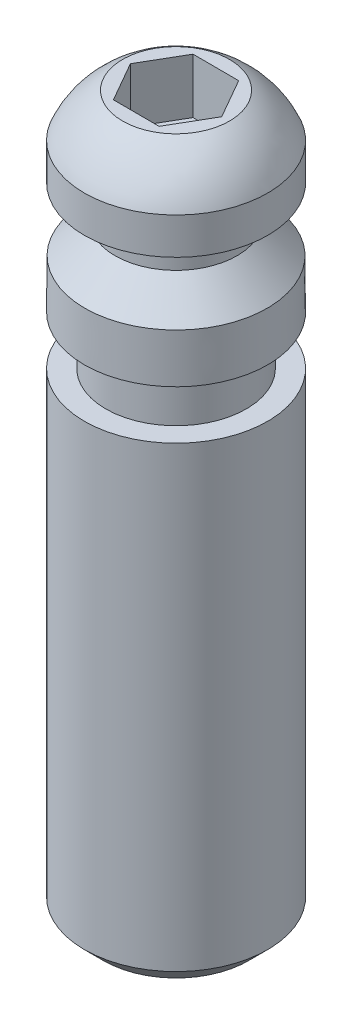
ISO-10303-21;
HEADER;
FILE_DESCRIPTION(('STEP AP214'),'2;1');
FILE_NAME('part.step','',(''),(''),'','','');
FILE_SCHEMA(('AUTOMOTIVE_DESIGN { 1 0 10303 214 1 1 1 1 }'));
ENDSEC;
DATA;
#1=APPLICATION_CONTEXT('core data for automotive mechanical design processes');
#2=APPLICATION_PROTOCOL_DEFINITION('international standard','automotive_design',2000,#1);
#3=PRODUCT_CONTEXT('',#1,'mechanical');
#4=PRODUCT('Part','Part','',(#3));
#5=PRODUCT_RELATED_PRODUCT_CATEGORY('part','',(#4));
#6=PRODUCT_DEFINITION_FORMATION('','',#4);
#7=PRODUCT_DEFINITION_CONTEXT('part definition',#1,'design');
#8=PRODUCT_DEFINITION('design','',#6,#7);
#9=PRODUCT_DEFINITION_SHAPE('','',#8);
#10=(LENGTH_UNIT() NAMED_UNIT(*) SI_UNIT(.MILLI.,.METRE.));
#11=(NAMED_UNIT(*) PLANE_ANGLE_UNIT() SI_UNIT($,.RADIAN.));
#12=(NAMED_UNIT(*) SI_UNIT($,.STERADIAN.) SOLID_ANGLE_UNIT());
#13=UNCERTAINTY_MEASURE_WITH_UNIT(LENGTH_MEASURE(1.E-05),#10,'distance_accuracy_value','');
#14=(GEOMETRIC_REPRESENTATION_CONTEXT(3) GLOBAL_UNCERTAINTY_ASSIGNED_CONTEXT((#13)) GLOBAL_UNIT_ASSIGNED_CONTEXT((#10,
#11,#12)) REPRESENTATION_CONTEXT('',''));
#15=CARTESIAN_POINT('',(0.,0.,0.));
#16=DIRECTION('',(0.,0.,1.));
#17=DIRECTION('',(1.,0.,0.));
#18=AXIS2_PLACEMENT_3D('',#15,#16,#17);
#19=CARTESIAN_POINT('',(0.,23.5,0.));
#20=DIRECTION('',(0.,-1.,0.));
#21=DIRECTION('',(0.,0.,-1.));
#22=AXIS2_PLACEMENT_3D('',#19,#20,#21);
#23=CYLINDRICAL_SURFACE('',#22,3.);
#24=CARTESIAN_POINT('',(0.,0.625000000000004,0.));
#25=DIRECTION('',(0.,1.,0.));
#26=DIRECTION('',(0.,0.,1.));
#27=AXIS2_PLACEMENT_3D('',#24,#25,#26);
#28=CIRCLE('',#27,3.);
#29=CARTESIAN_POINT('',(0.,0.625000000000004,3.));
#30=VERTEX_POINT('',#29);
#31=EDGE_CURVE('E44',#30,#30,#28,.T.);
#32=ORIENTED_EDGE('',*,*,#31,.T.);
#33=EDGE_LOOP('',(#32));
#34=FACE_BOUND('',#33,.T.);
#35=CARTESIAN_POINT('',(0.,15.6100982781377,0.));
#36=DIRECTION('',(0.,1.,0.));
#37=DIRECTION('',(0.,0.,1.));
#38=AXIS2_PLACEMENT_3D('',#35,#36,#37);
#39=CIRCLE('',#38,3.);
#40=CARTESIAN_POINT('',(0.,15.6100982781377,3.));
#41=VERTEX_POINT('',#40);
#42=EDGE_CURVE('E170',#41,#41,#39,.T.);
#43=ORIENTED_EDGE('',*,*,#42,.F.);
#44=EDGE_LOOP('',(#43));
#45=FACE_BOUND('',#44,.T.);
#46=ADVANCED_FACE('F35',(#34,#45),#23,.T.);
#47=CARTESIAN_POINT('',(0.,0.,0.));
#48=DIRECTION('',(0.,1.,0.));
#49=DIRECTION('',(0.,0.,1.));
#50=AXIS2_PLACEMENT_3D('',#47,#48,#49);
#51=PLANE('',#50);
#52=CARTESIAN_POINT('',(0.,0.,0.));
#53=DIRECTION('',(0.,1.,0.));
#54=DIRECTION('',(0.,0.,1.));
#55=AXIS2_PLACEMENT_3D('',#52,#53,#54);
#56=CIRCLE('',#55,2.37499999999999);
#57=CARTESIAN_POINT('',(0.,0.,2.37499999999999));
#58=VERTEX_POINT('',#57);
#59=EDGE_CURVE('E11',#58,#58,#56,.F.);
#60=ORIENTED_EDGE('',*,*,#59,.T.);
#61=EDGE_LOOP('',(#60));
#62=FACE_BOUND('',#61,.T.);
#63=ADVANCED_FACE('F192',(#62),#51,.F.);
#64=CARTESIAN_POINT('',(2.3,15.6100982781377,0.));
#65=DIRECTION('',(0.,1.,0.));
#66=DIRECTION('',(0.,0.,1.));
#67=AXIS2_PLACEMENT_3D('',#64,#65,#66);
#68=PLANE('',#67);
#69=CARTESIAN_POINT('',(0.,15.6100982781377,0.));
#70=DIRECTION('',(0.,1.,0.));
#71=DIRECTION('',(0.,0.,1.));
#72=AXIS2_PLACEMENT_3D('',#69,#70,#71);
#73=CIRCLE('',#72,2.3);
#74=CARTESIAN_POINT('',(0.,15.6100982781377,2.3));
#75=VERTEX_POINT('',#74);
#76=EDGE_CURVE('E164',#75,#75,#73,.T.);
#77=ORIENTED_EDGE('',*,*,#76,.F.);
#78=EDGE_LOOP('',(#77));
#79=FACE_BOUND('',#78,.T.);
#80=ORIENTED_EDGE('',*,*,#42,.T.);
#81=EDGE_LOOP('',(#80));
#82=FACE_BOUND('',#81,.T.);
#83=ADVANCED_FACE('F197',(#79,#82),#68,.T.);
#84=CARTESIAN_POINT('',(0.,23.5,0.));
#85=DIRECTION('',(0.,1.,0.));
#86=DIRECTION('',(0.,0.,1.));
#87=AXIS2_PLACEMENT_3D('',#84,#85,#86);
#88=CYLINDRICAL_SURFACE('',#87,2.3);
#89=ORIENTED_EDGE('',*,*,#76,.T.);
#90=EDGE_LOOP('',(#89));
#91=FACE_BOUND('',#90,.T.);
#92=CARTESIAN_POINT('',(0.,17.2100982781377,0.));
#93=DIRECTION('',(0.,1.,0.));
#94=DIRECTION('',(0.,0.,1.));
#95=AXIS2_PLACEMENT_3D('',#92,#93,#94);
#96=CIRCLE('',#95,2.3);
#97=CARTESIAN_POINT('',(0.,17.2100982781377,2.3));
#98=VERTEX_POINT('',#97);
#99=EDGE_CURVE('E161',#98,#98,#96,.T.);
#100=ORIENTED_EDGE('',*,*,#99,.F.);
#101=EDGE_LOOP('',(#100));
#102=FACE_BOUND('',#101,.T.);
#103=ADVANCED_FACE('F237',(#91,#102),#88,.T.);
#104=CARTESIAN_POINT('',(3.,17.2100982781377,0.));
#105=DIRECTION('',(0.,-1.,0.));
#106=DIRECTION('',(0.,0.,-1.));
#107=AXIS2_PLACEMENT_3D('',#104,#105,#106);
#108=PLANE('',#107);
#109=ORIENTED_EDGE('',*,*,#99,.T.);
#110=EDGE_LOOP('',(#109));
#111=FACE_BOUND('',#110,.T.);
#112=CARTESIAN_POINT('',(0.,17.2100982781377,0.));
#113=DIRECTION('',(0.,1.,0.));
#114=DIRECTION('',(0.,0.,1.));
#115=AXIS2_PLACEMENT_3D('',#112,#113,#114);
#116=CIRCLE('',#115,3.);
#117=CARTESIAN_POINT('',(0.,17.2100982781377,3.));
#118=VERTEX_POINT('',#117);
#119=EDGE_CURVE('E158',#118,#118,#116,.T.);
#120=ORIENTED_EDGE('',*,*,#119,.F.);
#121=EDGE_LOOP('',(#120));
#122=FACE_BOUND('',#121,.T.);
#123=ADVANCED_FACE('F233',(#111,#122),#108,.T.);
#124=CARTESIAN_POINT('',(0.,18.8100982781377,0.));
#125=DIRECTION('',(0.,-1.,0.));
#126=DIRECTION('',(0.,0.,-1.));
#127=AXIS2_PLACEMENT_3D('',#124,#125,#126);
#128=CONICAL_SURFACE('',#127,2.98680340663087,0.00824768383634046);
#129=ORIENTED_EDGE('',*,*,#119,.T.);
#130=EDGE_LOOP('',(#129));
#131=FACE_BOUND('',#130,.T.);
#132=CARTESIAN_POINT('',(0.,18.8100982781377,0.));
#133=DIRECTION('',(0.,1.,0.));
#134=DIRECTION('',(0.,0.,1.));
#135=AXIS2_PLACEMENT_3D('',#132,#133,#134);
#136=CIRCLE('',#135,2.98680340663087);
#137=CARTESIAN_POINT('',(0.,18.8100982781377,2.98680340663087));
#138=VERTEX_POINT('',#137);
#139=EDGE_CURVE('E155',#138,#138,#136,.T.);
#140=ORIENTED_EDGE('',*,*,#139,.F.);
#141=EDGE_LOOP('',(#140));
#142=FACE_BOUND('',#141,.T.);
#143=ADVANCED_FACE('F229',(#131,#142),#128,.T.);
#144=CARTESIAN_POINT('',(0.,19.8015328482781,0.));
#145=DIRECTION('',(0.,-1.,0.));
#146=DIRECTION('',(0.,0.,-1.));
#147=AXIS2_PLACEMENT_3D('',#144,#145,#146);
#148=CONICAL_SURFACE('',#147,1.99536883649042,0.785398163397447);
#149=ORIENTED_EDGE('',*,*,#139,.T.);
#150=EDGE_LOOP('',(#149));
#151=FACE_BOUND('',#150,.T.);
#152=CARTESIAN_POINT('',(0.,19.8015328482781,0.));
#153=DIRECTION('',(0.,1.,0.));
#154=DIRECTION('',(0.,0.,1.));
#155=AXIS2_PLACEMENT_3D('',#152,#153,#154);
#156=CIRCLE('',#155,1.99536883649042);
#157=CARTESIAN_POINT('',(0.,19.8015328482781,1.99536883649042));
#158=VERTEX_POINT('',#157);
#159=EDGE_CURVE('E152',#158,#158,#156,.T.);
#160=ORIENTED_EDGE('',*,*,#159,.F.);
#161=EDGE_LOOP('',(#160));
#162=FACE_BOUND('',#161,.T.);
#163=ADVANCED_FACE('F222',(#151,#162),#148,.T.);
#164=CARTESIAN_POINT('',(0.,23.5,0.));
#165=DIRECTION('',(0.,1.,0.));
#166=DIRECTION('',(0.,0.,1.));
#167=AXIS2_PLACEMENT_3D('',#164,#165,#166);
#168=CYLINDRICAL_SURFACE('',#167,1.99536883649042);
#169=ORIENTED_EDGE('',*,*,#159,.T.);
#170=EDGE_LOOP('',(#169));
#171=FACE_BOUND('',#170,.T.);
#172=CARTESIAN_POINT('',(0.,20.3015328482781,0.));
#173=DIRECTION('',(0.,1.,0.));
#174=DIRECTION('',(0.,0.,1.));
#175=AXIS2_PLACEMENT_3D('',#172,#173,#174);
#176=CIRCLE('',#175,1.99536883649042);
#177=CARTESIAN_POINT('',(0.,20.3015328482781,1.99536883649042));
#178=VERTEX_POINT('',#177);
#179=EDGE_CURVE('E149',#178,#178,#176,.T.);
#180=ORIENTED_EDGE('',*,*,#179,.F.);
#181=EDGE_LOOP('',(#180));
#182=FACE_BOUND('',#181,.T.);
#183=ADVANCED_FACE('F209',(#171,#182),#168,.T.);
#184=CARTESIAN_POINT('',(0.,20.8815569209667,0.));
#185=DIRECTION('',(0.,1.,0.));
#186=DIRECTION('',(0.,0.,1.));
#187=AXIS2_PLACEMENT_3D('',#184,#185,#186);
#188=CONICAL_SURFACE('',#187,3.,1.0471975511966);
#189=ORIENTED_EDGE('',*,*,#179,.T.);
#190=EDGE_LOOP('',(#189));
#191=FACE_BOUND('',#190,.T.);
#192=CARTESIAN_POINT('',(0.,20.8815569209667,0.));
#193=DIRECTION('',(0.,1.,0.));
#194=DIRECTION('',(0.,0.,1.));
#195=AXIS2_PLACEMENT_3D('',#192,#193,#194);
#196=CIRCLE('',#195,3.);
#197=CARTESIAN_POINT('',(0.,20.8815569209667,3.));
#198=VERTEX_POINT('',#197);
#199=EDGE_CURVE('E146',#198,#198,#196,.T.);
#200=ORIENTED_EDGE('',*,*,#199,.F.);
#201=EDGE_LOOP('',(#200));
#202=FACE_BOUND('',#201,.T.);
#203=ADVANCED_FACE('F201',(#191,#202),#188,.T.);
#204=ORIENTED_EDGE('',*,*,#199,.T.);
#205=EDGE_LOOP('',(#204));
#206=FACE_BOUND('',#205,.T.);
#207=CARTESIAN_POINT('',(0.,22.0815569209667,0.));
#208=DIRECTION('',(0.,1.,0.));
#209=DIRECTION('',(0.,0.,1.));
#210=AXIS2_PLACEMENT_3D('',#207,#208,#209);
#211=CIRCLE('',#210,3.);
#212=CARTESIAN_POINT('',(0.,22.0815569209667,3.));
#213=VERTEX_POINT('',#212);
#214=EDGE_CURVE('E138',#213,#213,#211,.T.);
#215=ORIENTED_EDGE('',*,*,#214,.F.);
#216=EDGE_LOOP('',(#215));
#217=FACE_BOUND('',#216,.T.);
#218=ADVANCED_FACE('F193',(#206,#217),#23,.T.);
#219=CARTESIAN_POINT('',(0.,20.9802578377791,0.));
#220=DIRECTION('',(0.,1.,0.));
#221=DIRECTION('',(0.,0.,1.));
#222=AXIS2_PLACEMENT_3D('',#219,#220,#221);
#223=DEGENERATE_TOROIDAL_SURFACE('',#222,0.320503642622429,2.89699161197085,.T.);
#224=ORIENTED_EDGE('',*,*,#214,.T.);
#225=EDGE_LOOP('',(#224));
#226=FACE_BOUND('',#225,.T.);
#227=CARTESIAN_POINT('',(0.,23.5,0.));
#228=DIRECTION('',(0.,1.,0.));
#229=DIRECTION('',(0.,0.,1.));
#230=AXIS2_PLACEMENT_3D('',#227,#228,#229);
#231=CIRCLE('',#230,1.75);
#232=CARTESIAN_POINT('',(0.,23.5,1.75));
#233=VERTEX_POINT('',#232);
#234=EDGE_CURVE('E167',#233,#233,#231,.T.);
#235=ORIENTED_EDGE('',*,*,#234,.F.);
#236=EDGE_LOOP('',(#235));
#237=FACE_BOUND('',#236,.T.);
#238=ADVANCED_FACE('F187',(#226,#237),#223,.T.);
#239=CARTESIAN_POINT('',(0.,23.5,0.));
#240=DIRECTION('',(0.,1.,0.));
#241=DIRECTION('',(0.,0.,1.));
#242=AXIS2_PLACEMENT_3D('',#239,#240,#241);
#243=PLANE('',#242);
#244=DIRECTION('',(0.999995251072331,0.,0.00308185541272703));
#245=VECTOR('',#244,1.);
#246=CARTESIAN_POINT('',(-0.753999885921567,23.5,1.29672054507911));
#247=LINE('',#246,#245);
#248=CARTESIAN_POINT('',(-0.753999885921567,23.5,1.29672054507911));
#249=VERTEX_POINT('',#248);
#250=CARTESIAN_POINT('',(0.745992990686931,23.5,1.3013433281982));
#251=VERTEX_POINT('',#250);
#252=EDGE_CURVE('E51',#249,#251,#247,.T.);
#253=ORIENTED_EDGE('',*,*,#252,.F.);
#254=DIRECTION('',(0.497328660457954,0.,0.8675622187988));
#255=VECTOR('',#254,1.);
#256=CARTESIAN_POINT('',(-1.4999928766085,23.5,-0.00462278311909011));
#257=LINE('',#256,#255);
#258=CARTESIAN_POINT('',(-1.4999928766085,23.5,-0.00462278311909011));
#259=VERTEX_POINT('',#258);
#260=EDGE_CURVE('E134',#259,#249,#257,.T.);
#261=ORIENTED_EDGE('',*,*,#260,.F.);
#262=DIRECTION('',(-0.502666590614378,0.,0.864480363386073));
#263=VECTOR('',#262,1.);
#264=CARTESIAN_POINT('',(-0.745992990686931,23.5,-1.3013433281982));
#265=LINE('',#264,#263);
#266=CARTESIAN_POINT('',(-0.745992990686931,23.5,-1.3013433281982));
#267=VERTEX_POINT('',#266);
#268=EDGE_CURVE('E132',#267,#259,#265,.T.);
#269=ORIENTED_EDGE('',*,*,#268,.F.);
#270=DIRECTION('',(-0.999995251072331,0.,-0.00308185541272688));
#271=VECTOR('',#270,1.);
#272=CARTESIAN_POINT('',(0.753999885921566,23.5,-1.29672054507911));
#273=LINE('',#272,#271);
#274=CARTESIAN_POINT('',(0.753999885921566,23.5,-1.29672054507911));
#275=VERTEX_POINT('',#274);
#276=EDGE_CURVE('E99',#275,#267,#273,.T.);
#277=ORIENTED_EDGE('',*,*,#276,.F.);
#278=DIRECTION('',(-0.497328660457954,0.,-0.8675622187988));
#279=VECTOR('',#278,1.);
#280=CARTESIAN_POINT('',(1.4999928766085,23.5,0.00462278311909022));
#281=LINE('',#280,#279);
#282=CARTESIAN_POINT('',(1.4999928766085,23.5,0.00462278311909022));
#283=VERTEX_POINT('',#282);
#284=EDGE_CURVE('E128',#283,#275,#281,.T.);
#285=ORIENTED_EDGE('',*,*,#284,.F.);
#286=DIRECTION('',(0.502666590614378,0.,-0.864480363386074));
#287=VECTOR('',#286,1.);
#288=CARTESIAN_POINT('',(0.74599299068693,23.5,1.3013433281982));
#289=LINE('',#288,#287);
#290=EDGE_CURVE('E125',#251,#283,#289,.T.);
#291=ORIENTED_EDGE('',*,*,#290,.F.);
#292=EDGE_LOOP('',(#253,#261,#269,#277,#285,#291));
#293=FACE_BOUND('',#292,.T.);
#294=ORIENTED_EDGE('',*,*,#234,.T.);
#295=EDGE_LOOP('',(#294));
#296=FACE_BOUND('',#295,.T.);
#297=ADVANCED_FACE('F179',(#293,#296),#243,.T.);
#298=CARTESIAN_POINT('',(0.,0.625000000000004,0.));
#299=DIRECTION('',(0.,1.,0.));
#300=DIRECTION('',(0.,0.,1.));
#301=AXIS2_PLACEMENT_3D('',#298,#299,#300);
#302=CONICAL_SURFACE('',#301,3.,0.785398163397452);
#303=ORIENTED_EDGE('',*,*,#59,.F.);
#304=EDGE_LOOP('',(#303));
#305=FACE_BOUND('',#304,.T.);
#306=ORIENTED_EDGE('',*,*,#31,.F.);
#307=EDGE_LOOP('',(#306));
#308=FACE_BOUND('',#307,.T.);
#309=ADVANCED_FACE('F38',(#305,#308),#302,.T.);
#310=CARTESIAN_POINT('',(-0.753999885921567,21.7,1.29672054507911));
#311=DIRECTION('',(-0.00308185541272703,0.,0.999995251072331));
#312=DIRECTION('',(0.999995251072332,0.,0.00308185541272703));
#313=AXIS2_PLACEMENT_3D('',#310,#311,#312);
#314=PLANE('',#313);
#315=ORIENTED_EDGE('',*,*,#252,.T.);
#316=DIRECTION('',(0.,1.,0.));
#317=VECTOR('',#316,1.);
#318=CARTESIAN_POINT('',(0.74599299068693,21.7,1.3013433281982));
#319=LINE('',#318,#317);
#320=CARTESIAN_POINT('',(0.74599299068693,21.7,1.3013433281982));
#321=VERTEX_POINT('',#320);
#322=EDGE_CURVE('E81',#321,#251,#319,.T.);
#323=ORIENTED_EDGE('',*,*,#322,.F.);
#324=DIRECTION('',(0.999995251072331,0.,0.00308185541272703));
#325=VECTOR('',#324,1.);
#326=CARTESIAN_POINT('',(-0.753999885921567,21.7,1.29672054507911));
#327=LINE('',#326,#325);
#328=CARTESIAN_POINT('',(-0.753999885921567,21.7,1.29672054507911));
#329=VERTEX_POINT('',#328);
#330=EDGE_CURVE('E136',#329,#321,#327,.T.);
#331=ORIENTED_EDGE('',*,*,#330,.F.);
#332=DIRECTION('',(0.,1.,0.));
#333=VECTOR('',#332,1.);
#334=CARTESIAN_POINT('',(-0.753999885921567,21.7,1.29672054507911));
#335=LINE('',#334,#333);
#336=EDGE_CURVE('E59',#329,#249,#335,.T.);
#337=ORIENTED_EDGE('',*,*,#336,.T.);
#338=EDGE_LOOP('',(#315,#323,#331,#337));
#339=FACE_BOUND('',#338,.T.);
#340=ADVANCED_FACE('F178',(#339),#314,.F.);
#341=CARTESIAN_POINT('',(-1.4999928766085,21.7,-0.00462278311909011));
#342=DIRECTION('',(-0.8675622187988,0.,0.497328660457954));
#343=DIRECTION('',(0.497328660457954,0.,0.8675622187988));
#344=AXIS2_PLACEMENT_3D('',#341,#342,#343);
#345=PLANE('',#344);
#346=ORIENTED_EDGE('',*,*,#260,.T.);
#347=ORIENTED_EDGE('',*,*,#336,.F.);
#348=DIRECTION('',(0.497328660457954,0.,0.8675622187988));
#349=VECTOR('',#348,1.);
#350=CARTESIAN_POINT('',(-1.4999928766085,21.7,-0.00462278311909011));
#351=LINE('',#350,#349);
#352=CARTESIAN_POINT('',(-1.4999928766085,21.7,-0.00462278311909011));
#353=VERTEX_POINT('',#352);
#354=EDGE_CURVE('E111',#353,#329,#351,.T.);
#355=ORIENTED_EDGE('',*,*,#354,.F.);
#356=DIRECTION('',(0.,1.,0.));
#357=VECTOR('',#356,1.);
#358=CARTESIAN_POINT('',(-1.4999928766085,21.7,-0.00462278311909011));
#359=LINE('',#358,#357);
#360=EDGE_CURVE('E103',#353,#259,#359,.T.);
#361=ORIENTED_EDGE('',*,*,#360,.T.);
#362=EDGE_LOOP('',(#346,#347,#355,#361));
#363=FACE_BOUND('',#362,.T.);
#364=ADVANCED_FACE('F185',(#363),#345,.F.);
#365=CARTESIAN_POINT('',(-0.745992990686931,21.7,-1.3013433281982));
#366=DIRECTION('',(-0.864480363386073,0.,-0.502666590614378));
#367=DIRECTION('',(-0.502666590614378,0.,0.864480363386074));
#368=AXIS2_PLACEMENT_3D('',#365,#366,#367);
#369=PLANE('',#368);
#370=ORIENTED_EDGE('',*,*,#268,.T.);
#371=ORIENTED_EDGE('',*,*,#360,.F.);
#372=DIRECTION('',(-0.502666590614378,0.,0.864480363386073));
#373=VECTOR('',#372,1.);
#374=CARTESIAN_POINT('',(-0.745992990686931,21.7,-1.3013433281982));
#375=LINE('',#374,#373);
#376=CARTESIAN_POINT('',(-0.745992990686931,21.7,-1.3013433281982));
#377=VERTEX_POINT('',#376);
#378=EDGE_CURVE('E107',#377,#353,#375,.T.);
#379=ORIENTED_EDGE('',*,*,#378,.F.);
#380=DIRECTION('',(0.,1.,0.));
#381=VECTOR('',#380,1.);
#382=CARTESIAN_POINT('',(-0.745992990686931,21.7,-1.3013433281982));
#383=LINE('',#382,#381);
#384=EDGE_CURVE('E92',#377,#267,#383,.T.);
#385=ORIENTED_EDGE('',*,*,#384,.T.);
#386=EDGE_LOOP('',(#370,#371,#379,#385));
#387=FACE_BOUND('',#386,.T.);
#388=ADVANCED_FACE('F108',(#387),#369,.F.);
#389=CARTESIAN_POINT('',(0.753999885921566,21.7,-1.29672054507911));
#390=DIRECTION('',(0.00308185541272688,0.,-0.999995251072331));
#391=DIRECTION('',(-0.999995251072331,0.,-0.00308185541272688));
#392=AXIS2_PLACEMENT_3D('',#389,#390,#391);
#393=PLANE('',#392);
#394=ORIENTED_EDGE('',*,*,#276,.T.);
#395=ORIENTED_EDGE('',*,*,#384,.F.);
#396=DIRECTION('',(-0.999995251072331,0.,-0.00308185541272688));
#397=VECTOR('',#396,1.);
#398=CARTESIAN_POINT('',(0.753999885921566,21.7,-1.29672054507911));
#399=LINE('',#398,#397);
#400=CARTESIAN_POINT('',(0.753999885921566,21.7,-1.29672054507911));
#401=VERTEX_POINT('',#400);
#402=EDGE_CURVE('E96',#401,#377,#399,.T.);
#403=ORIENTED_EDGE('',*,*,#402,.F.);
#404=DIRECTION('',(0.,1.,0.));
#405=VECTOR('',#404,1.);
#406=CARTESIAN_POINT('',(0.753999885921566,21.7,-1.29672054507911));
#407=LINE('',#406,#405);
#408=EDGE_CURVE('E104',#401,#275,#407,.T.);
#409=ORIENTED_EDGE('',*,*,#408,.T.);
#410=EDGE_LOOP('',(#394,#395,#403,#409));
#411=FACE_BOUND('',#410,.T.);
#412=ADVANCED_FACE('F94',(#411),#393,.F.);
#413=CARTESIAN_POINT('',(1.4999928766085,21.7,0.00462278311909022));
#414=DIRECTION('',(0.8675622187988,0.,-0.497328660457954));
#415=DIRECTION('',(-0.497328660457954,0.,-0.8675622187988));
#416=AXIS2_PLACEMENT_3D('',#413,#414,#415);
#417=PLANE('',#416);
#418=ORIENTED_EDGE('',*,*,#284,.T.);
#419=ORIENTED_EDGE('',*,*,#408,.F.);
#420=DIRECTION('',(-0.497328660457954,0.,-0.8675622187988));
#421=VECTOR('',#420,1.);
#422=CARTESIAN_POINT('',(1.4999928766085,21.7,0.00462278311909022));
#423=LINE('',#422,#421);
#424=CARTESIAN_POINT('',(1.4999928766085,21.7,0.00462278311909022));
#425=VERTEX_POINT('',#424);
#426=EDGE_CURVE('E117',#425,#401,#423,.T.);
#427=ORIENTED_EDGE('',*,*,#426,.F.);
#428=DIRECTION('',(0.,1.,0.));
#429=VECTOR('',#428,1.);
#430=CARTESIAN_POINT('',(1.4999928766085,21.7,0.00462278311909022));
#431=LINE('',#430,#429);
#432=EDGE_CURVE('E141',#425,#283,#431,.T.);
#433=ORIENTED_EDGE('',*,*,#432,.T.);
#434=EDGE_LOOP('',(#418,#419,#427,#433));
#435=FACE_BOUND('',#434,.T.);
#436=ADVANCED_FACE('F345',(#435),#417,.F.);
#437=CARTESIAN_POINT('',(0.74599299068693,21.7,1.3013433281982));
#438=DIRECTION('',(0.864480363386074,0.,0.502666590614378));
#439=DIRECTION('',(0.502666590614378,0.,-0.864480363386074));
#440=AXIS2_PLACEMENT_3D('',#437,#438,#439);
#441=PLANE('',#440);
#442=ORIENTED_EDGE('',*,*,#290,.T.);
#443=ORIENTED_EDGE('',*,*,#432,.F.);
#444=DIRECTION('',(0.502666590614378,0.,-0.864480363386074));
#445=VECTOR('',#444,1.);
#446=CARTESIAN_POINT('',(0.74599299068693,21.7,1.3013433281982));
#447=LINE('',#446,#445);
#448=EDGE_CURVE('E119',#321,#425,#447,.T.);
#449=ORIENTED_EDGE('',*,*,#448,.F.);
#450=ORIENTED_EDGE('',*,*,#322,.T.);
#451=EDGE_LOOP('',(#442,#443,#449,#450));
#452=FACE_BOUND('',#451,.T.);
#453=ADVANCED_FACE('F354',(#452),#441,.F.);
#454=CARTESIAN_POINT('',(0.,21.7,0.));
#455=DIRECTION('',(0.,1.,0.));
#456=DIRECTION('',(0.,0.,1.));
#457=AXIS2_PLACEMENT_3D('',#454,#455,#456);
#458=PLANE('',#457);
#459=ORIENTED_EDGE('',*,*,#330,.T.);
#460=ORIENTED_EDGE('',*,*,#448,.T.);
#461=ORIENTED_EDGE('',*,*,#426,.T.);
#462=ORIENTED_EDGE('',*,*,#402,.T.);
#463=ORIENTED_EDGE('',*,*,#378,.T.);
#464=ORIENTED_EDGE('',*,*,#354,.T.);
#465=EDGE_LOOP('',(#459,#460,#461,#462,#463,#464));
#466=FACE_BOUND('',#465,.T.);
#467=ADVANCED_FACE('F114',(#466),#458,.T.);
#468=CLOSED_SHELL('',(#46,#63,#83,#103,#123,#143,#163,#183,#203,#218,#238,#297,#309,#340,#364,
#388,#412,#436,#453,#467));
#469=MANIFOLD_SOLID_BREP('B2',#468);
#470=ADVANCED_BREP_SHAPE_REPRESENTATION('',(#18,#469),#14);
#471=SHAPE_DEFINITION_REPRESENTATION(#9,#470);
ENDSEC;
END-ISO-10303-21;
